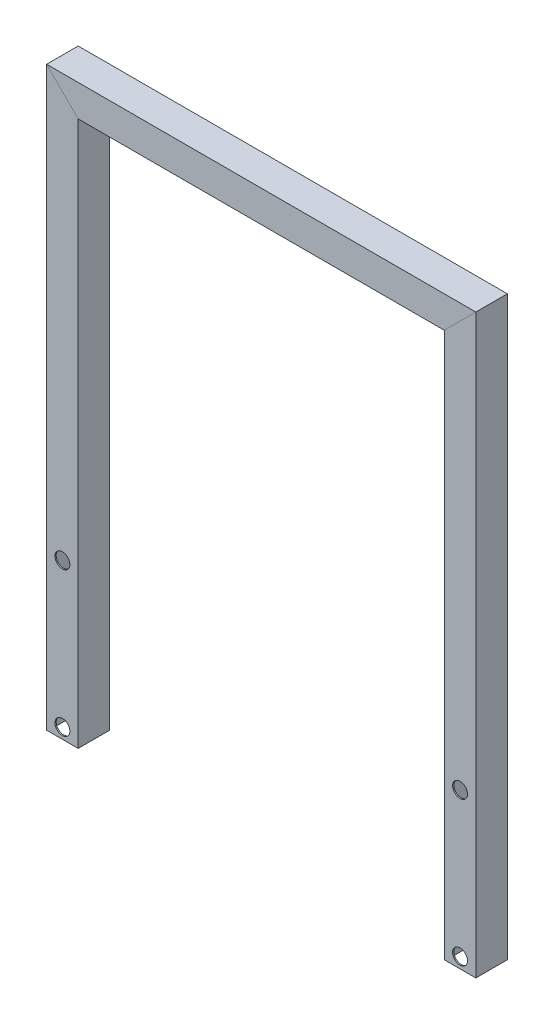
ISO-10303-21;
HEADER;
FILE_DESCRIPTION(('STEP AP214'),'2;1');
FILE_NAME('part.step','',(''),(''),'','','');
FILE_SCHEMA(('AUTOMOTIVE_DESIGN { 1 0 10303 214 1 1 1 1 }'));
ENDSEC;
DATA;
#1=APPLICATION_CONTEXT('core data for automotive mechanical design processes');
#2=APPLICATION_PROTOCOL_DEFINITION('international standard','automotive_design',2000,#1);
#3=PRODUCT_CONTEXT('',#1,'mechanical');
#4=PRODUCT('Part','Part','',(#3));
#5=PRODUCT_RELATED_PRODUCT_CATEGORY('part','',(#4));
#6=PRODUCT_DEFINITION_FORMATION('','',#4);
#7=PRODUCT_DEFINITION_CONTEXT('part definition',#1,'design');
#8=PRODUCT_DEFINITION('design','',#6,#7);
#9=PRODUCT_DEFINITION_SHAPE('','',#8);
#10=(LENGTH_UNIT() NAMED_UNIT(*) SI_UNIT(.MILLI.,.METRE.));
#11=(NAMED_UNIT(*) PLANE_ANGLE_UNIT() SI_UNIT($,.RADIAN.));
#12=(NAMED_UNIT(*) SI_UNIT($,.STERADIAN.) SOLID_ANGLE_UNIT());
#13=UNCERTAINTY_MEASURE_WITH_UNIT(LENGTH_MEASURE(1.E-05),#10,'distance_accuracy_value','');
#14=(GEOMETRIC_REPRESENTATION_CONTEXT(3) GLOBAL_UNCERTAINTY_ASSIGNED_CONTEXT((#13)) GLOBAL_UNIT_ASSIGNED_CONTEXT((#10,
#11,#12)) REPRESENTATION_CONTEXT('',''));
#15=CARTESIAN_POINT('',(0.,0.,0.));
#16=DIRECTION('',(0.,0.,1.));
#17=DIRECTION('',(1.,0.,0.));
#18=AXIS2_PLACEMENT_3D('',#15,#16,#17);
#19=CARTESIAN_POINT('',(-12.6999999999999,451.422308916705,12.7));
#20=DIRECTION('',(1.,0.,0.));
#21=DIRECTION('',(0.,0.,-1.));
#22=AXIS2_PLACEMENT_3D('',#19,#20,#21);
#23=PLANE('',#22);
#24=DIRECTION('',(0.,0.,1.));
#25=VECTOR('',#24,1.);
#26=CARTESIAN_POINT('',(-12.6999999999999,464.122308916705,12.7));
#27=LINE('',#26,#25);
#28=CARTESIAN_POINT('',(-12.6999999999999,464.122308916705,-12.7));
#29=VERTEX_POINT('',#28);
#30=CARTESIAN_POINT('',(-12.6999999999999,464.122308916705,12.7));
#31=VERTEX_POINT('',#30);
#32=EDGE_CURVE('E171',#29,#31,#27,.T.);
#33=ORIENTED_EDGE('',*,*,#32,.F.);
#34=DIRECTION('',(0.,-1.,0.));
#35=VECTOR('',#34,1.);
#36=CARTESIAN_POINT('',(-12.6999999999999,451.422308916705,-12.7));
#37=LINE('',#36,#35);
#38=CARTESIAN_POINT('',(-12.6999999999999,0.,-12.7));
#39=VERTEX_POINT('',#38);
#40=EDGE_CURVE('E167',#29,#39,#37,.T.);
#41=ORIENTED_EDGE('',*,*,#40,.T.);
#42=DIRECTION('',(0.,0.,1.));
#43=VECTOR('',#42,1.);
#44=CARTESIAN_POINT('',(-12.6999999999999,0.,12.7));
#45=LINE('',#44,#43);
#46=CARTESIAN_POINT('',(-12.6999999999999,0.,12.7));
#47=VERTEX_POINT('',#46);
#48=EDGE_CURVE('E194',#39,#47,#45,.T.);
#49=ORIENTED_EDGE('',*,*,#48,.T.);
#50=DIRECTION('',(0.,-1.,0.));
#51=VECTOR('',#50,1.);
#52=CARTESIAN_POINT('',(-12.6999999999999,451.422308916705,12.7));
#53=LINE('',#52,#51);
#54=EDGE_CURVE('E191',#31,#47,#53,.T.);
#55=ORIENTED_EDGE('',*,*,#54,.F.);
#56=EDGE_LOOP('',(#33,#41,#49,#55));
#57=FACE_BOUND('',#56,.T.);
#58=ADVANCED_FACE('F90',(#57),#23,.F.);
#59=CARTESIAN_POINT('',(12.7,451.422308916705,12.7));
#60=DIRECTION('',(0.,0.,-1.));
#61=DIRECTION('',(-1.,0.,0.));
#62=AXIS2_PLACEMENT_3D('',#59,#60,#61);
#63=PLANE('',#62);
#64=CARTESIAN_POINT('',(0.,8.58948173587412,12.7));
#65=DIRECTION('',(0.,0.,-1.));
#66=DIRECTION('',(-1.,0.,0.));
#67=AXIS2_PLACEMENT_3D('',#64,#65,#66);
#68=CIRCLE('',#67,6.00000000000004);
#69=CARTESIAN_POINT('',(-6.00000000000004,8.58948173587412,12.7));
#70=VERTEX_POINT('',#69);
#71=EDGE_CURVE('E198',#70,#70,#68,.F.);
#72=ORIENTED_EDGE('',*,*,#71,.F.);
#73=EDGE_LOOP('',(#72));
#74=FACE_BOUND('',#73,.T.);
#75=CARTESIAN_POINT('',(6.62248034188906E-11,124.72575791985,12.7));
#76=DIRECTION('',(0.,0.,-1.));
#77=DIRECTION('',(-1.,0.,0.));
#78=AXIS2_PLACEMENT_3D('',#75,#76,#77);
#79=CIRCLE('',#78,6.00000000003005);
#80=CARTESIAN_POINT('',(-5.99999999996382,124.72575791985,12.7));
#81=VERTEX_POINT('',#80);
#82=EDGE_CURVE('E231',#81,#81,#79,.F.);
#83=ORIENTED_EDGE('',*,*,#82,.F.);
#84=EDGE_LOOP('',(#83));
#85=FACE_BOUND('',#84,.T.);
#86=DIRECTION('',(0.707106781186547,-0.707106781186548,0.));
#87=VECTOR('',#86,1.);
#88=CARTESIAN_POINT('',(6.35000000000005,445.072308916705,12.7));
#89=LINE('',#88,#87);
#90=CARTESIAN_POINT('',(12.7,438.722308916705,12.7));
#91=VERTEX_POINT('',#90);
#92=EDGE_CURVE('E100',#31,#91,#89,.T.);
#93=ORIENTED_EDGE('',*,*,#92,.F.);
#94=ORIENTED_EDGE('',*,*,#54,.T.);
#95=DIRECTION('',(1.,0.,0.));
#96=VECTOR('',#95,1.);
#97=CARTESIAN_POINT('',(12.7,0.,12.7));
#98=LINE('',#97,#96);
#99=CARTESIAN_POINT('',(12.7,0.,12.7));
#100=VERTEX_POINT('',#99);
#101=EDGE_CURVE('E193',#47,#100,#98,.T.);
#102=ORIENTED_EDGE('',*,*,#101,.T.);
#103=DIRECTION('',(0.,-1.,0.));
#104=VECTOR('',#103,1.);
#105=CARTESIAN_POINT('',(12.7,451.422308916705,12.7));
#106=LINE('',#105,#104);
#107=EDGE_CURVE('E195',#91,#100,#106,.T.);
#108=ORIENTED_EDGE('',*,*,#107,.F.);
#109=EDGE_LOOP('',(#93,#94,#102,#108));
#110=FACE_BOUND('',#109,.T.);
#111=ADVANCED_FACE('F273',(#74,#85,#110),#63,.F.);
#112=CARTESIAN_POINT('',(12.7,451.422308916705,12.7));
#113=DIRECTION('',(-1.,0.,0.));
#114=DIRECTION('',(0.,0.,1.));
#115=AXIS2_PLACEMENT_3D('',#112,#113,#114);
#116=PLANE('',#115);
#117=DIRECTION('',(0.,0.,-1.));
#118=VECTOR('',#117,1.);
#119=CARTESIAN_POINT('',(12.7,438.722308916705,12.7));
#120=LINE('',#119,#118);
#121=CARTESIAN_POINT('',(12.7000000000001,438.722308916705,-12.7));
#122=VERTEX_POINT('',#121);
#123=EDGE_CURVE('E13',#91,#122,#120,.T.);
#124=ORIENTED_EDGE('',*,*,#123,.F.);
#125=ORIENTED_EDGE('',*,*,#107,.T.);
#126=DIRECTION('',(0.,0.,-1.));
#127=VECTOR('',#126,1.);
#128=CARTESIAN_POINT('',(12.7,0.,12.7));
#129=LINE('',#128,#127);
#130=CARTESIAN_POINT('',(12.7,0.,-12.7));
#131=VERTEX_POINT('',#130);
#132=EDGE_CURVE('E156',#100,#131,#129,.T.);
#133=ORIENTED_EDGE('',*,*,#132,.T.);
#134=DIRECTION('',(0.,-1.,0.));
#135=VECTOR('',#134,1.);
#136=CARTESIAN_POINT('',(12.7,451.422308916705,-12.7));
#137=LINE('',#136,#135);
#138=EDGE_CURVE('E151',#122,#131,#137,.T.);
#139=ORIENTED_EDGE('',*,*,#138,.F.);
#140=EDGE_LOOP('',(#124,#125,#133,#139));
#141=FACE_BOUND('',#140,.T.);
#142=ADVANCED_FACE('F153',(#141),#116,.F.);
#143=CARTESIAN_POINT('',(11.7,451.422308916705,11.7));
#144=DIRECTION('',(-1.,0.,0.));
#145=DIRECTION('',(0.,0.,1.));
#146=AXIS2_PLACEMENT_3D('',#143,#144,#145);
#147=PLANE('',#146);
#148=DIRECTION('',(0.,-1.,0.));
#149=VECTOR('',#148,1.);
#150=CARTESIAN_POINT('',(11.7,451.422308916705,11.7));
#151=LINE('',#150,#149);
#152=CARTESIAN_POINT('',(11.7,439.722308916705,11.7));
#153=VERTEX_POINT('',#152);
#154=CARTESIAN_POINT('',(11.7,0.,11.7));
#155=VERTEX_POINT('',#154);
#156=EDGE_CURVE('E186',#153,#155,#151,.T.);
#157=ORIENTED_EDGE('',*,*,#156,.F.);
#158=DIRECTION('',(0.,0.,-1.));
#159=VECTOR('',#158,1.);
#160=CARTESIAN_POINT('',(11.7,439.722308916705,11.7));
#161=LINE('',#160,#159);
#162=CARTESIAN_POINT('',(11.7,439.722308916705,-11.7));
#163=VERTEX_POINT('',#162);
#164=EDGE_CURVE('E181',#153,#163,#161,.T.);
#165=ORIENTED_EDGE('',*,*,#164,.T.);
#166=DIRECTION('',(0.,-1.,0.));
#167=VECTOR('',#166,1.);
#168=CARTESIAN_POINT('',(11.7,451.422308916705,-11.7));
#169=LINE('',#168,#167);
#170=CARTESIAN_POINT('',(11.7,0.,-11.7));
#171=VERTEX_POINT('',#170);
#172=EDGE_CURVE('E94',#163,#171,#169,.T.);
#173=ORIENTED_EDGE('',*,*,#172,.T.);
#174=DIRECTION('',(0.,0.,-1.));
#175=VECTOR('',#174,1.);
#176=CARTESIAN_POINT('',(11.7,0.,11.7));
#177=LINE('',#176,#175);
#178=EDGE_CURVE('E206',#155,#171,#177,.T.);
#179=ORIENTED_EDGE('',*,*,#178,.F.);
#180=EDGE_LOOP('',(#157,#165,#173,#179));
#181=FACE_BOUND('',#180,.T.);
#182=ADVANCED_FACE('F282',(#181),#147,.T.);
#183=CARTESIAN_POINT('',(11.7,451.422308916705,11.7));
#184=DIRECTION('',(0.,0.,-1.));
#185=DIRECTION('',(-1.,0.,0.));
#186=AXIS2_PLACEMENT_3D('',#183,#184,#185);
#187=PLANE('',#186);
#188=CARTESIAN_POINT('',(0.,8.58948173587412,11.7));
#189=DIRECTION('',(0.,0.,-1.));
#190=DIRECTION('',(-1.,0.,0.));
#191=AXIS2_PLACEMENT_3D('',#188,#189,#190);
#192=CIRCLE('',#191,6.00000000000004);
#193=CARTESIAN_POINT('',(-6.00000000000004,8.58948173587412,11.7));
#194=VERTEX_POINT('',#193);
#195=EDGE_CURVE('E225',#194,#194,#192,.F.);
#196=ORIENTED_EDGE('',*,*,#195,.T.);
#197=EDGE_LOOP('',(#196));
#198=FACE_BOUND('',#197,.T.);
#199=CARTESIAN_POINT('',(6.62248034188906E-11,124.72575791985,11.7));
#200=DIRECTION('',(0.,0.,-1.));
#201=DIRECTION('',(-1.,0.,0.));
#202=AXIS2_PLACEMENT_3D('',#199,#200,#201);
#203=CIRCLE('',#202,6.00000000003005);
#204=CARTESIAN_POINT('',(-5.99999999996382,124.72575791985,11.7));
#205=VERTEX_POINT('',#204);
#206=EDGE_CURVE('E234',#205,#205,#203,.F.);
#207=ORIENTED_EDGE('',*,*,#206,.T.);
#208=EDGE_LOOP('',(#207));
#209=FACE_BOUND('',#208,.T.);
#210=DIRECTION('',(0.,-1.,0.));
#211=VECTOR('',#210,1.);
#212=CARTESIAN_POINT('',(-11.6999999999999,451.422308916705,11.7));
#213=LINE('',#212,#211);
#214=CARTESIAN_POINT('',(-11.6999999999999,463.122308916705,11.7));
#215=VERTEX_POINT('',#214);
#216=CARTESIAN_POINT('',(-11.6999999999999,0.,11.7));
#217=VERTEX_POINT('',#216);
#218=EDGE_CURVE('E189',#215,#217,#213,.T.);
#219=ORIENTED_EDGE('',*,*,#218,.F.);
#220=DIRECTION('',(0.707106781186547,-0.707106781186548,0.));
#221=VECTOR('',#220,1.);
#222=CARTESIAN_POINT('',(5.85000000000005,445.572308916705,11.7));
#223=LINE('',#222,#221);
#224=EDGE_CURVE('E183',#215,#153,#223,.T.);
#225=ORIENTED_EDGE('',*,*,#224,.T.);
#226=ORIENTED_EDGE('',*,*,#156,.T.);
#227=DIRECTION('',(1.,0.,0.));
#228=VECTOR('',#227,1.);
#229=CARTESIAN_POINT('',(11.7,0.,11.7));
#230=LINE('',#229,#228);
#231=EDGE_CURVE('E172',#217,#155,#230,.T.);
#232=ORIENTED_EDGE('',*,*,#231,.F.);
#233=EDGE_LOOP('',(#219,#225,#226,#232));
#234=FACE_BOUND('',#233,.T.);
#235=ADVANCED_FACE('F286',(#198,#209,#234),#187,.T.);
#236=CARTESIAN_POINT('',(-11.6999999999999,451.422308916705,11.7));
#237=DIRECTION('',(1.,0.,0.));
#238=DIRECTION('',(0.,0.,-1.));
#239=AXIS2_PLACEMENT_3D('',#236,#237,#238);
#240=PLANE('',#239);
#241=DIRECTION('',(0.,-1.,0.));
#242=VECTOR('',#241,1.);
#243=CARTESIAN_POINT('',(-11.6999999999999,451.422308916705,-11.7));
#244=LINE('',#243,#242);
#245=CARTESIAN_POINT('',(-11.6999999999999,463.122308916705,-11.7));
#246=VERTEX_POINT('',#245);
#247=CARTESIAN_POINT('',(-11.6999999999999,0.,-11.7));
#248=VERTEX_POINT('',#247);
#249=EDGE_CURVE('E161',#246,#248,#244,.T.);
#250=ORIENTED_EDGE('',*,*,#249,.F.);
#251=DIRECTION('',(0.,0.,1.));
#252=VECTOR('',#251,1.);
#253=CARTESIAN_POINT('',(-11.6999999999999,463.122308916705,11.7));
#254=LINE('',#253,#252);
#255=EDGE_CURVE('E187',#246,#215,#254,.T.);
#256=ORIENTED_EDGE('',*,*,#255,.T.);
#257=ORIENTED_EDGE('',*,*,#218,.T.);
#258=DIRECTION('',(0.,0.,1.));
#259=VECTOR('',#258,1.);
#260=CARTESIAN_POINT('',(-11.6999999999999,0.,11.7));
#261=LINE('',#260,#259);
#262=EDGE_CURVE('E212',#248,#217,#261,.T.);
#263=ORIENTED_EDGE('',*,*,#262,.F.);
#264=EDGE_LOOP('',(#250,#256,#257,#263));
#265=FACE_BOUND('',#264,.T.);
#266=ADVANCED_FACE('F290',(#265),#240,.T.);
#267=CARTESIAN_POINT('',(11.7,451.422308916705,-11.7));
#268=DIRECTION('',(0.,0.,1.));
#269=DIRECTION('',(1.,0.,0.));
#270=AXIS2_PLACEMENT_3D('',#267,#268,#269);
#271=PLANE('',#270);
#272=CARTESIAN_POINT('',(0.,8.58948173587409,-11.7));
#273=DIRECTION('',(0.,0.,1.));
#274=DIRECTION('',(1.,0.,0.));
#275=AXIS2_PLACEMENT_3D('',#272,#273,#274);
#276=CIRCLE('',#275,6.00000000000004);
#277=CARTESIAN_POINT('',(6.00000000000004,8.58948173587409,-11.7));
#278=VERTEX_POINT('',#277);
#279=EDGE_CURVE('E228',#278,#278,#276,.F.);
#280=ORIENTED_EDGE('',*,*,#279,.T.);
#281=EDGE_LOOP('',(#280));
#282=FACE_BOUND('',#281,.T.);
#283=CARTESIAN_POINT('',(6.62248034188906E-11,124.72575791985,-11.7));
#284=DIRECTION('',(0.,0.,1.));
#285=DIRECTION('',(1.,0.,0.));
#286=AXIS2_PLACEMENT_3D('',#283,#284,#285);
#287=CIRCLE('',#286,6.00000000003005);
#288=CARTESIAN_POINT('',(6.00000000009627,124.72575791985,-11.7));
#289=VERTEX_POINT('',#288);
#290=EDGE_CURVE('E237',#289,#289,#287,.F.);
#291=ORIENTED_EDGE('',*,*,#290,.T.);
#292=EDGE_LOOP('',(#291));
#293=FACE_BOUND('',#292,.T.);
#294=ORIENTED_EDGE('',*,*,#172,.F.);
#295=DIRECTION('',(-0.707106781186547,0.707106781186548,0.));
#296=VECTOR('',#295,1.);
#297=CARTESIAN_POINT('',(5.85000000000004,445.572308916705,-11.7));
#298=LINE('',#297,#296);
#299=EDGE_CURVE('E108',#163,#246,#298,.T.);
#300=ORIENTED_EDGE('',*,*,#299,.T.);
#301=ORIENTED_EDGE('',*,*,#249,.T.);
#302=DIRECTION('',(-1.,0.,0.));
#303=VECTOR('',#302,1.);
#304=CARTESIAN_POINT('',(11.7,0.,-11.7));
#305=LINE('',#304,#303);
#306=EDGE_CURVE('E209',#171,#248,#305,.T.);
#307=ORIENTED_EDGE('',*,*,#306,.F.);
#308=EDGE_LOOP('',(#294,#300,#301,#307));
#309=FACE_BOUND('',#308,.T.);
#310=ADVANCED_FACE('F252',(#282,#293,#309),#271,.T.);
#311=CARTESIAN_POINT('',(12.7,451.422308916705,-12.7));
#312=DIRECTION('',(0.,0.,1.));
#313=DIRECTION('',(1.,0.,0.));
#314=AXIS2_PLACEMENT_3D('',#311,#312,#313);
#315=PLANE('',#314);
#316=CARTESIAN_POINT('',(0.,8.58948173587409,-12.7000000000001));
#317=DIRECTION('',(0.,0.,1.));
#318=DIRECTION('',(1.,0.,0.));
#319=AXIS2_PLACEMENT_3D('',#316,#317,#318);
#320=CIRCLE('',#319,6.00000000000004);
#321=CARTESIAN_POINT('',(6.00000000000004,8.58948173587409,-12.7000000000001));
#322=VERTEX_POINT('',#321);
#323=EDGE_CURVE('E240',#322,#322,#320,.F.);
#324=ORIENTED_EDGE('',*,*,#323,.F.);
#325=EDGE_LOOP('',(#324));
#326=FACE_BOUND('',#325,.T.);
#327=CARTESIAN_POINT('',(6.62248034188906E-11,124.72575791985,-12.7000000000001));
#328=DIRECTION('',(0.,0.,1.));
#329=DIRECTION('',(1.,0.,0.));
#330=AXIS2_PLACEMENT_3D('',#327,#328,#329);
#331=CIRCLE('',#330,6.00000000003005);
#332=CARTESIAN_POINT('',(6.00000000009627,124.72575791985,-12.7000000000001));
#333=VERTEX_POINT('',#332);
#334=EDGE_CURVE('E241',#333,#333,#331,.F.);
#335=ORIENTED_EDGE('',*,*,#334,.F.);
#336=EDGE_LOOP('',(#335));
#337=FACE_BOUND('',#336,.T.);
#338=DIRECTION('',(-0.707106781186547,0.707106781186548,0.));
#339=VECTOR('',#338,1.);
#340=CARTESIAN_POINT('',(6.35000000000005,445.072308916705,-12.7));
#341=LINE('',#340,#339);
#342=EDGE_CURVE('E165',#122,#29,#341,.T.);
#343=ORIENTED_EDGE('',*,*,#342,.F.);
#344=ORIENTED_EDGE('',*,*,#138,.T.);
#345=DIRECTION('',(-1.,0.,0.));
#346=VECTOR('',#345,1.);
#347=CARTESIAN_POINT('',(12.7,0.,-12.7));
#348=LINE('',#347,#346);
#349=EDGE_CURVE('E160',#131,#39,#348,.T.);
#350=ORIENTED_EDGE('',*,*,#349,.T.);
#351=ORIENTED_EDGE('',*,*,#40,.F.);
#352=EDGE_LOOP('',(#343,#344,#350,#351));
#353=FACE_BOUND('',#352,.T.);
#354=ADVANCED_FACE('F166',(#326,#337,#353),#315,.F.);
#355=CARTESIAN_POINT('',(320.,-1.11022302462516E-13,0.));
#356=DIRECTION('',(0.,1.,0.));
#357=DIRECTION('',(0.,0.,-1.));
#358=AXIS2_PLACEMENT_3D('',#355,#356,#357);
#359=PLANE('',#358);
#360=ORIENTED_EDGE('',*,*,#178,.T.);
#361=ORIENTED_EDGE('',*,*,#306,.T.);
#362=ORIENTED_EDGE('',*,*,#262,.T.);
#363=ORIENTED_EDGE('',*,*,#231,.T.);
#364=EDGE_LOOP('',(#360,#361,#362,#363));
#365=FACE_BOUND('',#364,.T.);
#366=ORIENTED_EDGE('',*,*,#48,.F.);
#367=ORIENTED_EDGE('',*,*,#349,.F.);
#368=ORIENTED_EDGE('',*,*,#132,.F.);
#369=ORIENTED_EDGE('',*,*,#101,.F.);
#370=EDGE_LOOP('',(#366,#367,#368,#369));
#371=FACE_BOUND('',#370,.T.);
#372=ADVANCED_FACE('F251',(#365,#371),#359,.F.);
#373=CARTESIAN_POINT('',(0.,451.422308916705,0.));
#374=DIRECTION('',(0.707106781186548,0.707106781186547,0.));
#375=DIRECTION('',(-0.707106781186547,0.707106781186548,0.));
#376=AXIS2_PLACEMENT_3D('',#373,#374,#375);
#377=PLANE('',#376);
#378=ORIENTED_EDGE('',*,*,#164,.F.);
#379=ORIENTED_EDGE('',*,*,#224,.F.);
#380=ORIENTED_EDGE('',*,*,#255,.F.);
#381=ORIENTED_EDGE('',*,*,#299,.F.);
#382=EDGE_LOOP('',(#378,#379,#380,#381));
#383=FACE_BOUND('',#382,.T.);
#384=ORIENTED_EDGE('',*,*,#342,.T.);
#385=ORIENTED_EDGE('',*,*,#32,.T.);
#386=ORIENTED_EDGE('',*,*,#92,.T.);
#387=ORIENTED_EDGE('',*,*,#123,.T.);
#388=EDGE_LOOP('',(#384,#385,#386,#387));
#389=FACE_BOUND('',#388,.T.);
#390=ADVANCED_FACE('F92',(#383,#389),#377,.T.);
#391=CARTESIAN_POINT('',(6.62248034188906E-11,124.72575791985,-12.7000000000001));
#392=DIRECTION('',(0.,0.,1.));
#393=DIRECTION('',(1.,0.,0.));
#394=AXIS2_PLACEMENT_3D('',#391,#392,#393);
#395=CYLINDRICAL_SURFACE('',#394,6.00000000003005);
#396=ORIENTED_EDGE('',*,*,#290,.F.);
#397=EDGE_LOOP('',(#396));
#398=FACE_BOUND('',#397,.T.);
#399=ORIENTED_EDGE('',*,*,#334,.T.);
#400=EDGE_LOOP('',(#399));
#401=FACE_BOUND('',#400,.T.);
#402=ADVANCED_FACE('F256',(#398,#401),#395,.F.);
#403=CARTESIAN_POINT('',(0.,8.58948173587409,-12.7000000000001));
#404=DIRECTION('',(0.,0.,1.));
#405=DIRECTION('',(1.,0.,0.));
#406=AXIS2_PLACEMENT_3D('',#403,#404,#405);
#407=CYLINDRICAL_SURFACE('',#406,6.00000000000004);
#408=ORIENTED_EDGE('',*,*,#279,.F.);
#409=EDGE_LOOP('',(#408));
#410=FACE_BOUND('',#409,.T.);
#411=ORIENTED_EDGE('',*,*,#323,.T.);
#412=EDGE_LOOP('',(#411));
#413=FACE_BOUND('',#412,.T.);
#414=ADVANCED_FACE('F247',(#410,#413),#407,.F.);
#415=ORIENTED_EDGE('',*,*,#206,.F.);
#416=EDGE_LOOP('',(#415));
#417=FACE_BOUND('',#416,.T.);
#418=ORIENTED_EDGE('',*,*,#82,.T.);
#419=EDGE_LOOP('',(#418));
#420=FACE_BOUND('',#419,.T.);
#421=ADVANCED_FACE('F260',(#417,#420),#395,.F.);
#422=ORIENTED_EDGE('',*,*,#195,.F.);
#423=EDGE_LOOP('',(#422));
#424=FACE_BOUND('',#423,.T.);
#425=ORIENTED_EDGE('',*,*,#71,.T.);
#426=EDGE_LOOP('',(#425));
#427=FACE_BOUND('',#426,.T.);
#428=ADVANCED_FACE('F267',(#424,#427),#407,.F.);
#429=CLOSED_SHELL('',(#58,#111,#142,#182,#235,#266,#310,#354,#372,#390,#402,#414,#421,#428));
#430=MANIFOLD_SOLID_BREP('B2',#429);
#431=CARTESIAN_POINT('',(320.,464.122308916705,12.6999999999999));
#432=DIRECTION('',(0.,-1.,0.));
#433=DIRECTION('',(0.,0.,-1.));
#434=AXIS2_PLACEMENT_3D('',#431,#432,#433);
#435=PLANE('',#434);
#436=DIRECTION('',(0.,0.,-1.));
#437=VECTOR('',#436,1.);
#438=CARTESIAN_POINT('',(-12.6999999999999,464.122308916705,12.7000000000001));
#439=LINE('',#438,#437);
#440=CARTESIAN_POINT('',(-12.6999999999999,464.122308916705,12.7));
#441=VERTEX_POINT('',#440);
#442=CARTESIAN_POINT('',(-12.6999999999999,464.122308916705,-12.7));
#443=VERTEX_POINT('',#442);
#444=EDGE_CURVE('E580',#441,#443,#439,.T.);
#445=ORIENTED_EDGE('',*,*,#444,.F.);
#446=DIRECTION('',(-1.,0.,0.));
#447=VECTOR('',#446,1.);
#448=CARTESIAN_POINT('',(320.,464.122308916705,12.6999999999999));
#449=LINE('',#448,#447);
#450=CARTESIAN_POINT('',(332.7,464.122308916705,12.6999999999999));
#451=VERTEX_POINT('',#450);
#452=EDGE_CURVE('E609',#451,#441,#449,.T.);
#453=ORIENTED_EDGE('',*,*,#452,.F.);
#454=DIRECTION('',(0.,0.,1.));
#455=VECTOR('',#454,1.);
#456=CARTESIAN_POINT('',(332.7,464.122308916705,12.6999999999999));
#457=LINE('',#456,#455);
#458=CARTESIAN_POINT('',(332.7,464.122308916705,-12.7000000000001));
#459=VERTEX_POINT('',#458);
#460=EDGE_CURVE('E572',#459,#451,#457,.T.);
#461=ORIENTED_EDGE('',*,*,#460,.F.);
#462=DIRECTION('',(-1.,0.,0.));
#463=VECTOR('',#462,1.);
#464=CARTESIAN_POINT('',(320.,464.122308916705,-12.7000000000001));
#465=LINE('',#464,#463);
#466=EDGE_CURVE('E491',#459,#443,#465,.T.);
#467=ORIENTED_EDGE('',*,*,#466,.T.);
#468=EDGE_LOOP('',(#445,#453,#461,#467));
#469=FACE_BOUND('',#468,.T.);
#470=ADVANCED_FACE('F487',(#469),#435,.F.);
#471=CARTESIAN_POINT('',(320.,438.722308916705,12.6999999999999));
#472=DIRECTION('',(0.,0.,-1.));
#473=DIRECTION('',(-1.,0.,0.));
#474=AXIS2_PLACEMENT_3D('',#471,#472,#473);
#475=PLANE('',#474);
#476=DIRECTION('',(-0.707106781186547,0.707106781186548,0.));
#477=VECTOR('',#476,1.);
#478=CARTESIAN_POINT('',(166.35,285.072308916705,12.6999999999999));
#479=LINE('',#478,#477);
#480=CARTESIAN_POINT('',(12.7000000000001,438.722308916705,12.7));
#481=VERTEX_POINT('',#480);
#482=EDGE_CURVE('E577',#481,#441,#479,.T.);
#483=ORIENTED_EDGE('',*,*,#482,.F.);
#484=DIRECTION('',(-1.,0.,0.));
#485=VECTOR('',#484,1.);
#486=CARTESIAN_POINT('',(320.,438.722308916705,12.6999999999999));
#487=LINE('',#486,#485);
#488=CARTESIAN_POINT('',(307.3,438.722308916705,12.6999999999999));
#489=VERTEX_POINT('',#488);
#490=EDGE_CURVE('E608',#489,#481,#487,.T.);
#491=ORIENTED_EDGE('',*,*,#490,.F.);
#492=DIRECTION('',(-0.707106781186547,-0.707106781186548,0.));
#493=VECTOR('',#492,1.);
#494=CARTESIAN_POINT('',(313.65,445.072308916705,12.6999999999999));
#495=LINE('',#494,#493);
#496=EDGE_CURVE('E576',#451,#489,#495,.T.);
#497=ORIENTED_EDGE('',*,*,#496,.F.);
#498=ORIENTED_EDGE('',*,*,#452,.T.);
#499=EDGE_LOOP('',(#483,#491,#497,#498));
#500=FACE_BOUND('',#499,.T.);
#501=ADVANCED_FACE('F615',(#500),#475,.F.);
#502=CARTESIAN_POINT('',(320.,438.722308916705,12.6999999999999));
#503=DIRECTION('',(0.,1.,0.));
#504=DIRECTION('',(0.,0.,1.));
#505=AXIS2_PLACEMENT_3D('',#502,#503,#504);
#506=PLANE('',#505);
#507=DIRECTION('',(0.,0.,1.));
#508=VECTOR('',#507,1.);
#509=CARTESIAN_POINT('',(12.7000000000001,438.722308916705,12.7000000000001));
#510=LINE('',#509,#508);
#511=CARTESIAN_POINT('',(12.7000000000001,438.722308916705,-12.7));
#512=VERTEX_POINT('',#511);
#513=EDGE_CURVE('E88',#512,#481,#510,.T.);
#514=ORIENTED_EDGE('',*,*,#513,.F.);
#515=DIRECTION('',(-1.,0.,0.));
#516=VECTOR('',#515,1.);
#517=CARTESIAN_POINT('',(320.,438.722308916705,-12.7000000000001));
#518=LINE('',#517,#516);
#519=CARTESIAN_POINT('',(307.3,438.722308916705,-12.7000000000001));
#520=VERTEX_POINT('',#519);
#521=EDGE_CURVE('E554',#520,#512,#518,.T.);
#522=ORIENTED_EDGE('',*,*,#521,.F.);
#523=DIRECTION('',(0.,0.,-1.));
#524=VECTOR('',#523,1.);
#525=CARTESIAN_POINT('',(307.3,438.722308916705,12.6999999999999));
#526=LINE('',#525,#524);
#527=EDGE_CURVE('E559',#489,#520,#526,.T.);
#528=ORIENTED_EDGE('',*,*,#527,.F.);
#529=ORIENTED_EDGE('',*,*,#490,.T.);
#530=EDGE_LOOP('',(#514,#522,#528,#529));
#531=FACE_BOUND('',#530,.T.);
#532=ADVANCED_FACE('F556',(#531),#506,.F.);
#533=CARTESIAN_POINT('',(320.,439.722308916705,11.6999999999999));
#534=DIRECTION('',(0.,1.,0.));
#535=DIRECTION('',(0.,0.,1.));
#536=AXIS2_PLACEMENT_3D('',#533,#534,#535);
#537=PLANE('',#536);
#538=DIRECTION('',(-1.,0.,0.));
#539=VECTOR('',#538,1.);
#540=CARTESIAN_POINT('',(320.,439.722308916705,-11.7000000000001));
#541=LINE('',#540,#539);
#542=CARTESIAN_POINT('',(308.3,439.722308916705,-11.7000000000001));
#543=VERTEX_POINT('',#542);
#544=CARTESIAN_POINT('',(11.7000000000001,439.722308916705,-11.7));
#545=VERTEX_POINT('',#544);
#546=EDGE_CURVE('E593',#543,#545,#541,.T.);
#547=ORIENTED_EDGE('',*,*,#546,.T.);
#548=DIRECTION('',(0.,0.,1.));
#549=VECTOR('',#548,1.);
#550=CARTESIAN_POINT('',(11.7000000000001,439.722308916705,11.7000000000001));
#551=LINE('',#550,#549);
#552=CARTESIAN_POINT('',(11.7000000000001,439.722308916705,11.7));
#553=VERTEX_POINT('',#552);
#554=EDGE_CURVE('E521',#545,#553,#551,.T.);
#555=ORIENTED_EDGE('',*,*,#554,.T.);
#556=DIRECTION('',(-1.,0.,0.));
#557=VECTOR('',#556,1.);
#558=CARTESIAN_POINT('',(320.,439.722308916705,11.6999999999999));
#559=LINE('',#558,#557);
#560=CARTESIAN_POINT('',(308.3,439.722308916705,11.6999999999999));
#561=VERTEX_POINT('',#560);
#562=EDGE_CURVE('E596',#561,#553,#559,.T.);
#563=ORIENTED_EDGE('',*,*,#562,.F.);
#564=DIRECTION('',(0.,0.,-1.));
#565=VECTOR('',#564,1.);
#566=CARTESIAN_POINT('',(308.3,439.722308916705,11.6999999999999));
#567=LINE('',#566,#565);
#568=EDGE_CURVE('E592',#561,#543,#567,.T.);
#569=ORIENTED_EDGE('',*,*,#568,.T.);
#570=EDGE_LOOP('',(#547,#555,#563,#569));
#571=FACE_BOUND('',#570,.T.);
#572=ADVANCED_FACE('F632',(#571),#537,.T.);
#573=CARTESIAN_POINT('',(320.,439.722308916705,11.6999999999999));
#574=DIRECTION('',(0.,0.,-1.));
#575=DIRECTION('',(-1.,0.,0.));
#576=AXIS2_PLACEMENT_3D('',#573,#574,#575);
#577=PLANE('',#576);
#578=ORIENTED_EDGE('',*,*,#562,.T.);
#579=DIRECTION('',(-0.707106781186547,0.707106781186548,0.));
#580=VECTOR('',#579,1.);
#581=CARTESIAN_POINT('',(165.85,285.572308916705,11.6999999999999));
#582=LINE('',#581,#580);
#583=CARTESIAN_POINT('',(-11.6999999999999,463.122308916705,11.7000000000002));
#584=VERTEX_POINT('',#583);
#585=EDGE_CURVE('E506',#553,#584,#582,.T.);
#586=ORIENTED_EDGE('',*,*,#585,.T.);
#587=DIRECTION('',(-1.,0.,0.));
#588=VECTOR('',#587,1.);
#589=CARTESIAN_POINT('',(320.,463.122308916705,11.6999999999999));
#590=LINE('',#589,#588);
#591=CARTESIAN_POINT('',(331.7,463.122308916705,11.7));
#592=VERTEX_POINT('',#591);
#593=EDGE_CURVE('E600',#592,#584,#590,.T.);
#594=ORIENTED_EDGE('',*,*,#593,.F.);
#595=DIRECTION('',(-0.707106781186547,-0.707106781186548,0.));
#596=VECTOR('',#595,1.);
#597=CARTESIAN_POINT('',(314.15,445.572308916705,11.6999999999999));
#598=LINE('',#597,#596);
#599=EDGE_CURVE('E595',#592,#561,#598,.T.);
#600=ORIENTED_EDGE('',*,*,#599,.T.);
#601=EDGE_LOOP('',(#578,#586,#594,#600));
#602=FACE_BOUND('',#601,.T.);
#603=ADVANCED_FACE('F630',(#602),#577,.T.);
#604=CARTESIAN_POINT('',(320.,463.122308916705,11.6999999999999));
#605=DIRECTION('',(0.,-1.,0.));
#606=DIRECTION('',(0.,0.,-1.));
#607=AXIS2_PLACEMENT_3D('',#604,#605,#606);
#608=PLANE('',#607);
#609=ORIENTED_EDGE('',*,*,#593,.T.);
#610=DIRECTION('',(0.,0.,-1.));
#611=VECTOR('',#610,1.);
#612=CARTESIAN_POINT('',(-11.6999999999999,463.122308916705,11.7000000000001));
#613=LINE('',#612,#611);
#614=CARTESIAN_POINT('',(-11.6999999999998,463.122308916705,-11.7));
#615=VERTEX_POINT('',#614);
#616=EDGE_CURVE('E597',#584,#615,#613,.T.);
#617=ORIENTED_EDGE('',*,*,#616,.T.);
#618=DIRECTION('',(-1.,0.,0.));
#619=VECTOR('',#618,1.);
#620=CARTESIAN_POINT('',(320.,463.122308916705,-11.7000000000001));
#621=LINE('',#620,#619);
#622=CARTESIAN_POINT('',(331.7,463.122308916705,-11.7000000000001));
#623=VERTEX_POINT('',#622);
#624=EDGE_CURVE('E588',#623,#615,#621,.T.);
#625=ORIENTED_EDGE('',*,*,#624,.F.);
#626=DIRECTION('',(0.,0.,1.));
#627=VECTOR('',#626,1.);
#628=CARTESIAN_POINT('',(331.7,463.122308916705,11.6999999999999));
#629=LINE('',#628,#627);
#630=EDGE_CURVE('E599',#623,#592,#629,.T.);
#631=ORIENTED_EDGE('',*,*,#630,.T.);
#632=EDGE_LOOP('',(#609,#617,#625,#631));
#633=FACE_BOUND('',#632,.T.);
#634=ADVANCED_FACE('F625',(#633),#608,.T.);
#635=CARTESIAN_POINT('',(320.,439.722308916705,-11.7000000000001));
#636=DIRECTION('',(0.,0.,1.));
#637=DIRECTION('',(1.,0.,0.));
#638=AXIS2_PLACEMENT_3D('',#635,#636,#637);
#639=PLANE('',#638);
#640=ORIENTED_EDGE('',*,*,#624,.T.);
#641=DIRECTION('',(0.707106781186547,-0.707106781186548,0.));
#642=VECTOR('',#641,1.);
#643=CARTESIAN_POINT('',(165.85,285.572308916705,-11.7000000000001));
#644=LINE('',#643,#642);
#645=EDGE_CURVE('E516',#615,#545,#644,.T.);
#646=ORIENTED_EDGE('',*,*,#645,.T.);
#647=ORIENTED_EDGE('',*,*,#546,.F.);
#648=DIRECTION('',(0.707106781186547,0.707106781186548,0.));
#649=VECTOR('',#648,1.);
#650=CARTESIAN_POINT('',(314.15,445.572308916705,-11.7000000000001));
#651=LINE('',#650,#649);
#652=EDGE_CURVE('E565',#543,#623,#651,.T.);
#653=ORIENTED_EDGE('',*,*,#652,.T.);
#654=EDGE_LOOP('',(#640,#646,#647,#653));
#655=FACE_BOUND('',#654,.T.);
#656=ADVANCED_FACE('F635',(#655),#639,.T.);
#657=CARTESIAN_POINT('',(320.,438.722308916705,-12.7000000000001));
#658=DIRECTION('',(0.,0.,1.));
#659=DIRECTION('',(1.,0.,0.));
#660=AXIS2_PLACEMENT_3D('',#657,#658,#659);
#661=PLANE('',#660);
#662=DIRECTION('',(0.707106781186547,-0.707106781186548,0.));
#663=VECTOR('',#662,1.);
#664=CARTESIAN_POINT('',(166.35,285.072308916705,-12.7000000000001));
#665=LINE('',#664,#663);
#666=EDGE_CURVE('E497',#443,#512,#665,.T.);
#667=ORIENTED_EDGE('',*,*,#666,.F.);
#668=ORIENTED_EDGE('',*,*,#466,.F.);
#669=DIRECTION('',(0.707106781186547,0.707106781186548,0.));
#670=VECTOR('',#669,1.);
#671=CARTESIAN_POINT('',(313.65,445.072308916705,-12.7000000000001));
#672=LINE('',#671,#670);
#673=EDGE_CURVE('E564',#520,#459,#672,.T.);
#674=ORIENTED_EDGE('',*,*,#673,.F.);
#675=ORIENTED_EDGE('',*,*,#521,.T.);
#676=EDGE_LOOP('',(#667,#668,#674,#675));
#677=FACE_BOUND('',#676,.T.);
#678=ADVANCED_FACE('F568',(#677),#661,.F.);
#679=CARTESIAN_POINT('',(320.,451.422308916705,0.));
#680=DIRECTION('',(0.707106781186548,-0.707106781186547,0.));
#681=DIRECTION('',(0.707106781186547,0.707106781186548,0.));
#682=AXIS2_PLACEMENT_3D('',#679,#680,#681);
#683=PLANE('',#682);
#684=ORIENTED_EDGE('',*,*,#568,.F.);
#685=ORIENTED_EDGE('',*,*,#599,.F.);
#686=ORIENTED_EDGE('',*,*,#630,.F.);
#687=ORIENTED_EDGE('',*,*,#652,.F.);
#688=EDGE_LOOP('',(#684,#685,#686,#687));
#689=FACE_BOUND('',#688,.T.);
#690=ORIENTED_EDGE('',*,*,#673,.T.);
#691=ORIENTED_EDGE('',*,*,#460,.T.);
#692=ORIENTED_EDGE('',*,*,#496,.T.);
#693=ORIENTED_EDGE('',*,*,#527,.T.);
#694=EDGE_LOOP('',(#690,#691,#692,#693));
#695=FACE_BOUND('',#694,.T.);
#696=ADVANCED_FACE('F575',(#689,#695),#683,.T.);
#697=CARTESIAN_POINT('',(0.,451.422308916705,0.));
#698=DIRECTION('',(-0.707106781186548,-0.707106781186547,0.));
#699=DIRECTION('',(0.707106781186547,-0.707106781186548,0.));
#700=AXIS2_PLACEMENT_3D('',#697,#698,#699);
#701=PLANE('',#700);
#702=ORIENTED_EDGE('',*,*,#554,.F.);
#703=ORIENTED_EDGE('',*,*,#645,.F.);
#704=ORIENTED_EDGE('',*,*,#616,.F.);
#705=ORIENTED_EDGE('',*,*,#585,.F.);
#706=EDGE_LOOP('',(#702,#703,#704,#705));
#707=FACE_BOUND('',#706,.T.);
#708=ORIENTED_EDGE('',*,*,#482,.T.);
#709=ORIENTED_EDGE('',*,*,#444,.T.);
#710=ORIENTED_EDGE('',*,*,#666,.T.);
#711=ORIENTED_EDGE('',*,*,#513,.T.);
#712=EDGE_LOOP('',(#708,#709,#710,#711));
#713=FACE_BOUND('',#712,.T.);
#714=ADVANCED_FACE('F489',(#707,#713),#701,.T.);
#715=CLOSED_SHELL('',(#470,#501,#532,#572,#603,#634,#656,#678,#696,#714));
#716=MANIFOLD_SOLID_BREP('B7',#715);
#717=CARTESIAN_POINT('',(332.7,0.,12.7));
#718=DIRECTION('',(-1.,0.,0.));
#719=DIRECTION('',(0.,0.,1.));
#720=AXIS2_PLACEMENT_3D('',#717,#718,#719);
#721=PLANE('',#720);
#722=DIRECTION('',(0.,0.,-1.));
#723=VECTOR('',#722,1.);
#724=CARTESIAN_POINT('',(332.7,464.122308916705,12.7000000000001));
#725=LINE('',#724,#723);
#726=CARTESIAN_POINT('',(332.7,464.122308916705,12.6999999999999));
#727=VERTEX_POINT('',#726);
#728=CARTESIAN_POINT('',(332.7,464.122308916705,-12.7000000000001));
#729=VERTEX_POINT('',#728);
#730=EDGE_CURVE('E871',#727,#729,#725,.T.);
#731=ORIENTED_EDGE('',*,*,#730,.F.);
#732=DIRECTION('',(0.,1.,0.));
#733=VECTOR('',#732,1.);
#734=CARTESIAN_POINT('',(332.7,0.,12.7));
#735=LINE('',#734,#733);
#736=CARTESIAN_POINT('',(332.7,0.,12.7));
#737=VERTEX_POINT('',#736);
#738=EDGE_CURVE('E882',#737,#727,#735,.T.);
#739=ORIENTED_EDGE('',*,*,#738,.F.);
#740=DIRECTION('',(0.,0.,1.));
#741=VECTOR('',#740,1.);
#742=CARTESIAN_POINT('',(332.7,0.,12.7));
#743=LINE('',#742,#741);
#744=CARTESIAN_POINT('',(332.7,0.,-12.7));
#745=VERTEX_POINT('',#744);
#746=EDGE_CURVE('E892',#745,#737,#743,.T.);
#747=ORIENTED_EDGE('',*,*,#746,.F.);
#748=DIRECTION('',(0.,1.,0.));
#749=VECTOR('',#748,1.);
#750=CARTESIAN_POINT('',(332.7,0.,-12.7));
#751=LINE('',#750,#749);
#752=EDGE_CURVE('E886',#745,#729,#751,.T.);
#753=ORIENTED_EDGE('',*,*,#752,.T.);
#754=EDGE_LOOP('',(#731,#739,#747,#753));
#755=FACE_BOUND('',#754,.T.);
#756=ADVANCED_FACE('F773',(#755),#721,.F.);
#757=CARTESIAN_POINT('',(307.3,0.,12.7));
#758=DIRECTION('',(0.,0.,-1.));
#759=DIRECTION('',(0.,1.,0.));
#760=AXIS2_PLACEMENT_3D('',#757,#758,#759);
#761=PLANE('',#760);
#762=CARTESIAN_POINT('',(319.999999999997,8.58948173587412,12.7));
#763=DIRECTION('',(0.,0.,-1.));
#764=DIRECTION('',(0.,1.,0.));
#765=AXIS2_PLACEMENT_3D('',#762,#763,#764);
#766=CIRCLE('',#765,6.00000000000005);
#767=CARTESIAN_POINT('',(319.999999999997,14.5894817358742,12.7));
#768=VERTEX_POINT('',#767);
#769=EDGE_CURVE('E893',#768,#768,#766,.T.);
#770=ORIENTED_EDGE('',*,*,#769,.T.);
#771=EDGE_LOOP('',(#770));
#772=FACE_BOUND('',#771,.T.);
#773=CARTESIAN_POINT('',(319.999999999931,124.72575791985,12.7));
#774=DIRECTION('',(0.,0.,-1.));
#775=DIRECTION('',(0.,1.,0.));
#776=AXIS2_PLACEMENT_3D('',#773,#774,#775);
#777=CIRCLE('',#776,6.00000000003296);
#778=CARTESIAN_POINT('',(319.999999999931,130.725757919883,12.7));
#779=VERTEX_POINT('',#778);
#780=EDGE_CURVE('E915',#779,#779,#777,.T.);
#781=ORIENTED_EDGE('',*,*,#780,.T.);
#782=EDGE_LOOP('',(#781));
#783=FACE_BOUND('',#782,.T.);
#784=DIRECTION('',(0.707106781186548,0.707106781186548,0.));
#785=VECTOR('',#784,1.);
#786=CARTESIAN_POINT('',(87.9388455416473,219.361154458353,12.7));
#787=LINE('',#786,#785);
#788=CARTESIAN_POINT('',(307.3,438.722308916705,12.6999999999999));
#789=VERTEX_POINT('',#788);
#790=EDGE_CURVE('E874',#789,#727,#787,.T.);
#791=ORIENTED_EDGE('',*,*,#790,.F.);
#792=DIRECTION('',(0.,1.,0.));
#793=VECTOR('',#792,1.);
#794=CARTESIAN_POINT('',(307.3,0.,12.7));
#795=LINE('',#794,#793);
#796=CARTESIAN_POINT('',(307.3,0.,12.7));
#797=VERTEX_POINT('',#796);
#798=EDGE_CURVE('E885',#797,#789,#795,.T.);
#799=ORIENTED_EDGE('',*,*,#798,.F.);
#800=DIRECTION('',(-1.,0.,0.));
#801=VECTOR('',#800,1.);
#802=CARTESIAN_POINT('',(307.3,0.,12.7));
#803=LINE('',#802,#801);
#804=EDGE_CURVE('E902',#737,#797,#803,.T.);
#805=ORIENTED_EDGE('',*,*,#804,.F.);
#806=ORIENTED_EDGE('',*,*,#738,.T.);
#807=EDGE_LOOP('',(#791,#799,#805,#806));
#808=FACE_BOUND('',#807,.T.);
#809=ADVANCED_FACE('F951',(#772,#783,#808),#761,.F.);
#810=CARTESIAN_POINT('',(307.3,0.,12.7));
#811=DIRECTION('',(1.,0.,0.));
#812=DIRECTION('',(0.,0.,-1.));
#813=AXIS2_PLACEMENT_3D('',#810,#811,#812);
#814=PLANE('',#813);
#815=DIRECTION('',(0.,0.,1.));
#816=VECTOR('',#815,1.);
#817=CARTESIAN_POINT('',(307.3,438.722308916705,12.7000000000001));
#818=LINE('',#817,#816);
#819=CARTESIAN_POINT('',(307.3,438.722308916705,-12.7000000000001));
#820=VERTEX_POINT('',#819);
#821=EDGE_CURVE('E485',#820,#789,#818,.T.);
#822=ORIENTED_EDGE('',*,*,#821,.F.);
#823=DIRECTION('',(0.,1.,0.));
#824=VECTOR('',#823,1.);
#825=CARTESIAN_POINT('',(307.3,0.,-12.7));
#826=LINE('',#825,#824);
#827=CARTESIAN_POINT('',(307.3,0.,-12.7));
#828=VERTEX_POINT('',#827);
#829=EDGE_CURVE('E889',#828,#820,#826,.T.);
#830=ORIENTED_EDGE('',*,*,#829,.F.);
#831=DIRECTION('',(0.,0.,-1.));
#832=VECTOR('',#831,1.);
#833=CARTESIAN_POINT('',(307.3,0.,12.7));
#834=LINE('',#833,#832);
#835=EDGE_CURVE('E904',#797,#828,#834,.T.);
#836=ORIENTED_EDGE('',*,*,#835,.F.);
#837=ORIENTED_EDGE('',*,*,#798,.T.);
#838=EDGE_LOOP('',(#822,#830,#836,#837));
#839=FACE_BOUND('',#838,.T.);
#840=ADVANCED_FACE('F956',(#839),#814,.F.);
#841=CARTESIAN_POINT('',(308.3,0.,11.7));
#842=DIRECTION('',(1.,0.,0.));
#843=DIRECTION('',(0.,0.,-1.));
#844=AXIS2_PLACEMENT_3D('',#841,#842,#843);
#845=PLANE('',#844);
#846=DIRECTION('',(0.,1.,0.));
#847=VECTOR('',#846,1.);
#848=CARTESIAN_POINT('',(308.3,0.,-11.7));
#849=LINE('',#848,#847);
#850=CARTESIAN_POINT('',(308.3,0.,-11.7));
#851=VERTEX_POINT('',#850);
#852=CARTESIAN_POINT('',(308.3,439.722308916705,-11.7000000000001));
#853=VERTEX_POINT('',#852);
#854=EDGE_CURVE('E777',#851,#853,#849,.T.);
#855=ORIENTED_EDGE('',*,*,#854,.T.);
#856=DIRECTION('',(0.,0.,1.));
#857=VECTOR('',#856,1.);
#858=CARTESIAN_POINT('',(308.3,439.722308916705,11.7000000000001));
#859=LINE('',#858,#857);
#860=CARTESIAN_POINT('',(308.3,439.722308916705,11.6999999999999));
#861=VERTEX_POINT('',#860);
#862=EDGE_CURVE('E807',#853,#861,#859,.T.);
#863=ORIENTED_EDGE('',*,*,#862,.T.);
#864=DIRECTION('',(0.,1.,0.));
#865=VECTOR('',#864,1.);
#866=CARTESIAN_POINT('',(308.3,0.,11.7));
#867=LINE('',#866,#865);
#868=CARTESIAN_POINT('',(308.3,0.,11.7));
#869=VERTEX_POINT('',#868);
#870=EDGE_CURVE('E845',#869,#861,#867,.T.);
#871=ORIENTED_EDGE('',*,*,#870,.F.);
#872=DIRECTION('',(0.,0.,-1.));
#873=VECTOR('',#872,1.);
#874=CARTESIAN_POINT('',(308.3,0.,11.7));
#875=LINE('',#874,#873);
#876=EDGE_CURVE('E848',#869,#851,#875,.T.);
#877=ORIENTED_EDGE('',*,*,#876,.T.);
#878=EDGE_LOOP('',(#855,#863,#871,#877));
#879=FACE_BOUND('',#878,.T.);
#880=ADVANCED_FACE('F847',(#879),#845,.T.);
#881=CARTESIAN_POINT('',(308.3,0.,11.7));
#882=DIRECTION('',(0.,0.,-1.));
#883=DIRECTION('',(0.,1.,0.));
#884=AXIS2_PLACEMENT_3D('',#881,#882,#883);
#885=PLANE('',#884);
#886=CARTESIAN_POINT('',(319.999999999997,8.58948173587409,11.7));
#887=DIRECTION('',(0.,0.,-1.));
#888=DIRECTION('',(0.,1.,0.));
#889=AXIS2_PLACEMENT_3D('',#886,#887,#888);
#890=CIRCLE('',#889,6.00000000000005);
#891=CARTESIAN_POINT('',(319.999999999997,14.5894817358741,11.7));
#892=VERTEX_POINT('',#891);
#893=EDGE_CURVE('E909',#892,#892,#890,.T.);
#894=ORIENTED_EDGE('',*,*,#893,.F.);
#895=EDGE_LOOP('',(#894));
#896=FACE_BOUND('',#895,.T.);
#897=CARTESIAN_POINT('',(319.999999999931,124.72575791985,11.7));
#898=DIRECTION('',(0.,0.,-1.));
#899=DIRECTION('',(0.,1.,0.));
#900=AXIS2_PLACEMENT_3D('',#897,#898,#899);
#901=CIRCLE('',#900,6.00000000003296);
#902=CARTESIAN_POINT('',(319.999999999931,130.725757919883,11.7));
#903=VERTEX_POINT('',#902);
#904=EDGE_CURVE('E918',#903,#903,#901,.T.);
#905=ORIENTED_EDGE('',*,*,#904,.F.);
#906=EDGE_LOOP('',(#905));
#907=FACE_BOUND('',#906,.T.);
#908=ORIENTED_EDGE('',*,*,#870,.T.);
#909=DIRECTION('',(0.707106781186548,0.707106781186548,0.));
#910=VECTOR('',#909,1.);
#911=CARTESIAN_POINT('',(88.4388455416473,219.861154458353,11.7));
#912=LINE('',#911,#910);
#913=CARTESIAN_POINT('',(331.7,463.122308916705,11.7));
#914=VERTEX_POINT('',#913);
#915=EDGE_CURVE('E792',#861,#914,#912,.T.);
#916=ORIENTED_EDGE('',*,*,#915,.T.);
#917=DIRECTION('',(0.,1.,0.));
#918=VECTOR('',#917,1.);
#919=CARTESIAN_POINT('',(331.7,0.,11.7));
#920=LINE('',#919,#918);
#921=CARTESIAN_POINT('',(331.7,0.,11.7));
#922=VERTEX_POINT('',#921);
#923=EDGE_CURVE('E840',#922,#914,#920,.T.);
#924=ORIENTED_EDGE('',*,*,#923,.F.);
#925=DIRECTION('',(-1.,0.,0.));
#926=VECTOR('',#925,1.);
#927=CARTESIAN_POINT('',(308.3,0.,11.7));
#928=LINE('',#927,#926);
#929=EDGE_CURVE('E855',#922,#869,#928,.T.);
#930=ORIENTED_EDGE('',*,*,#929,.T.);
#931=EDGE_LOOP('',(#908,#916,#924,#930));
#932=FACE_BOUND('',#931,.T.);
#933=ADVANCED_FACE('F860',(#896,#907,#932),#885,.T.);
#934=CARTESIAN_POINT('',(331.7,0.,11.7));
#935=DIRECTION('',(-1.,0.,0.));
#936=DIRECTION('',(0.,0.,1.));
#937=AXIS2_PLACEMENT_3D('',#934,#935,#936);
#938=PLANE('',#937);
#939=ORIENTED_EDGE('',*,*,#923,.T.);
#940=DIRECTION('',(0.,0.,-1.));
#941=VECTOR('',#940,1.);
#942=CARTESIAN_POINT('',(331.7,463.122308916705,11.7000000000001));
#943=LINE('',#942,#941);
#944=CARTESIAN_POINT('',(331.7,463.122308916705,-11.7000000000001));
#945=VERTEX_POINT('',#944);
#946=EDGE_CURVE('E862',#914,#945,#943,.T.);
#947=ORIENTED_EDGE('',*,*,#946,.T.);
#948=DIRECTION('',(0.,1.,0.));
#949=VECTOR('',#948,1.);
#950=CARTESIAN_POINT('',(331.7,0.,-11.7));
#951=LINE('',#950,#949);
#952=CARTESIAN_POINT('',(331.7,0.,-11.7));
#953=VERTEX_POINT('',#952);
#954=EDGE_CURVE('E870',#953,#945,#951,.T.);
#955=ORIENTED_EDGE('',*,*,#954,.F.);
#956=DIRECTION('',(0.,0.,1.));
#957=VECTOR('',#956,1.);
#958=CARTESIAN_POINT('',(331.7,0.,11.7));
#959=LINE('',#958,#957);
#960=EDGE_CURVE('E866',#953,#922,#959,.T.);
#961=ORIENTED_EDGE('',*,*,#960,.T.);
#962=EDGE_LOOP('',(#939,#947,#955,#961));
#963=FACE_BOUND('',#962,.T.);
#964=ADVANCED_FACE('F897',(#963),#938,.T.);
#965=CARTESIAN_POINT('',(308.3,0.,-11.7));
#966=DIRECTION('',(0.,0.,1.));
#967=DIRECTION('',(0.,-1.,0.));
#968=AXIS2_PLACEMENT_3D('',#965,#966,#967);
#969=PLANE('',#968);
#970=CARTESIAN_POINT('',(319.999999999997,8.58948173587412,-11.7));
#971=DIRECTION('',(0.,0.,1.));
#972=DIRECTION('',(0.,-1.,0.));
#973=AXIS2_PLACEMENT_3D('',#970,#971,#972);
#974=CIRCLE('',#973,6.00000000000005);
#975=CARTESIAN_POINT('',(319.999999999997,2.58948173587407,-11.7));
#976=VERTEX_POINT('',#975);
#977=EDGE_CURVE('E912',#976,#976,#974,.T.);
#978=ORIENTED_EDGE('',*,*,#977,.F.);
#979=EDGE_LOOP('',(#978));
#980=FACE_BOUND('',#979,.T.);
#981=CARTESIAN_POINT('',(319.999999999931,124.72575791985,-11.7));
#982=DIRECTION('',(0.,0.,1.));
#983=DIRECTION('',(0.,-1.,0.));
#984=AXIS2_PLACEMENT_3D('',#981,#982,#983);
#985=CIRCLE('',#984,6.00000000003296);
#986=CARTESIAN_POINT('',(319.999999999931,118.725757919817,-11.7));
#987=VERTEX_POINT('',#986);
#988=EDGE_CURVE('E921',#987,#987,#985,.T.);
#989=ORIENTED_EDGE('',*,*,#988,.F.);
#990=EDGE_LOOP('',(#989));
#991=FACE_BOUND('',#990,.T.);
#992=ORIENTED_EDGE('',*,*,#954,.T.);
#993=DIRECTION('',(-0.707106781186548,-0.707106781186548,0.));
#994=VECTOR('',#993,1.);
#995=CARTESIAN_POINT('',(88.4388455416473,219.861154458353,-11.7));
#996=LINE('',#995,#994);
#997=EDGE_CURVE('E802',#945,#853,#996,.T.);
#998=ORIENTED_EDGE('',*,*,#997,.T.);
#999=ORIENTED_EDGE('',*,*,#854,.F.);
#1000=DIRECTION('',(1.,0.,0.));
#1001=VECTOR('',#1000,1.);
#1002=CARTESIAN_POINT('',(308.3,0.,-11.7));
#1003=LINE('',#1002,#1001);
#1004=EDGE_CURVE('E858',#851,#953,#1003,.T.);
#1005=ORIENTED_EDGE('',*,*,#1004,.T.);
#1006=EDGE_LOOP('',(#992,#998,#999,#1005));
#1007=FACE_BOUND('',#1006,.T.);
#1008=ADVANCED_FACE('F898',(#980,#991,#1007),#969,.T.);
#1009=CARTESIAN_POINT('',(307.3,0.,-12.7));
#1010=DIRECTION('',(0.,0.,1.));
#1011=DIRECTION('',(0.,-1.,0.));
#1012=AXIS2_PLACEMENT_3D('',#1009,#1010,#1011);
#1013=PLANE('',#1012);
#1014=CARTESIAN_POINT('',(319.999999999997,8.58948173587412,-12.7000000000001));
#1015=DIRECTION('',(0.,0.,1.));
#1016=DIRECTION('',(1.,0.,0.));
#1017=AXIS2_PLACEMENT_3D('',#1014,#1015,#1016);
#1018=CIRCLE('',#1017,6.00000000000005);
#1019=CARTESIAN_POINT('',(325.999999999997,8.58948173587412,-12.7000000000001));
#1020=VERTEX_POINT('',#1019);
#1021=EDGE_CURVE('E924',#1020,#1020,#1018,.T.);
#1022=ORIENTED_EDGE('',*,*,#1021,.T.);
#1023=EDGE_LOOP('',(#1022));
#1024=FACE_BOUND('',#1023,.T.);
#1025=CARTESIAN_POINT('',(319.999999999931,124.72575791985,-12.7000000000001));
#1026=DIRECTION('',(0.,0.,1.));
#1027=DIRECTION('',(1.,0.,0.));
#1028=AXIS2_PLACEMENT_3D('',#1025,#1026,#1027);
#1029=CIRCLE('',#1028,6.00000000003296);
#1030=CARTESIAN_POINT('',(325.999999999964,124.72575791985,-12.7000000000001));
#1031=VERTEX_POINT('',#1030);
#1032=EDGE_CURVE('E925',#1031,#1031,#1029,.T.);
#1033=ORIENTED_EDGE('',*,*,#1032,.T.);
#1034=EDGE_LOOP('',(#1033));
#1035=FACE_BOUND('',#1034,.T.);
#1036=DIRECTION('',(-0.707106781186548,-0.707106781186548,0.));
#1037=VECTOR('',#1036,1.);
#1038=CARTESIAN_POINT('',(87.9388455416473,219.361154458353,-12.7));
#1039=LINE('',#1038,#1037);
#1040=EDGE_CURVE('E783',#729,#820,#1039,.T.);
#1041=ORIENTED_EDGE('',*,*,#1040,.F.);
#1042=ORIENTED_EDGE('',*,*,#752,.F.);
#1043=DIRECTION('',(1.,0.,0.));
#1044=VECTOR('',#1043,1.);
#1045=CARTESIAN_POINT('',(307.3,0.,-12.7));
#1046=LINE('',#1045,#1044);
#1047=EDGE_CURVE('E876',#828,#745,#1046,.T.);
#1048=ORIENTED_EDGE('',*,*,#1047,.F.);
#1049=ORIENTED_EDGE('',*,*,#829,.T.);
#1050=EDGE_LOOP('',(#1041,#1042,#1048,#1049));
#1051=FACE_BOUND('',#1050,.T.);
#1052=ADVANCED_FACE('F931',(#1024,#1035,#1051),#1013,.F.);
#1053=CARTESIAN_POINT('',(0.,0.,0.));
#1054=DIRECTION('',(0.,-1.,0.));
#1055=DIRECTION('',(0.,0.,-1.));
#1056=AXIS2_PLACEMENT_3D('',#1053,#1054,#1055);
#1057=PLANE('',#1056);
#1058=ORIENTED_EDGE('',*,*,#876,.F.);
#1059=ORIENTED_EDGE('',*,*,#929,.F.);
#1060=ORIENTED_EDGE('',*,*,#960,.F.);
#1061=ORIENTED_EDGE('',*,*,#1004,.F.);
#1062=EDGE_LOOP('',(#1058,#1059,#1060,#1061));
#1063=FACE_BOUND('',#1062,.T.);
#1064=ORIENTED_EDGE('',*,*,#746,.T.);
#1065=ORIENTED_EDGE('',*,*,#804,.T.);
#1066=ORIENTED_EDGE('',*,*,#835,.T.);
#1067=ORIENTED_EDGE('',*,*,#1047,.T.);
#1068=EDGE_LOOP('',(#1064,#1065,#1066,#1067));
#1069=FACE_BOUND('',#1068,.T.);
#1070=ADVANCED_FACE('F852',(#1063,#1069),#1057,.T.);
#1071=CARTESIAN_POINT('',(320.,451.422308916705,0.));
#1072=DIRECTION('',(-0.707106781186548,0.707106781186548,0.));
#1073=DIRECTION('',(-0.707106781186548,-0.707106781186548,0.));
#1074=AXIS2_PLACEMENT_3D('',#1071,#1072,#1073);
#1075=PLANE('',#1074);
#1076=ORIENTED_EDGE('',*,*,#862,.F.);
#1077=ORIENTED_EDGE('',*,*,#997,.F.);
#1078=ORIENTED_EDGE('',*,*,#946,.F.);
#1079=ORIENTED_EDGE('',*,*,#915,.F.);
#1080=EDGE_LOOP('',(#1076,#1077,#1078,#1079));
#1081=FACE_BOUND('',#1080,.T.);
#1082=ORIENTED_EDGE('',*,*,#790,.T.);
#1083=ORIENTED_EDGE('',*,*,#730,.T.);
#1084=ORIENTED_EDGE('',*,*,#1040,.T.);
#1085=ORIENTED_EDGE('',*,*,#821,.T.);
#1086=EDGE_LOOP('',(#1082,#1083,#1084,#1085));
#1087=FACE_BOUND('',#1086,.T.);
#1088=ADVANCED_FACE('F775',(#1081,#1087),#1075,.T.);
#1089=CARTESIAN_POINT('',(319.999999999931,124.72575791985,-12.7000000000001));
#1090=DIRECTION('',(0.,0.,1.));
#1091=DIRECTION('',(1.,0.,0.));
#1092=AXIS2_PLACEMENT_3D('',#1089,#1090,#1091);
#1093=CYLINDRICAL_SURFACE('',#1092,6.00000000003296);
#1094=ORIENTED_EDGE('',*,*,#988,.T.);
#1095=EDGE_LOOP('',(#1094));
#1096=FACE_BOUND('',#1095,.T.);
#1097=ORIENTED_EDGE('',*,*,#1032,.F.);
#1098=EDGE_LOOP('',(#1097));
#1099=FACE_BOUND('',#1098,.T.);
#1100=ADVANCED_FACE('F937',(#1096,#1099),#1093,.F.);
#1101=CARTESIAN_POINT('',(319.999999999997,8.58948173587412,-12.7000000000001));
#1102=DIRECTION('',(0.,0.,1.));
#1103=DIRECTION('',(1.,0.,0.));
#1104=AXIS2_PLACEMENT_3D('',#1101,#1102,#1103);
#1105=CYLINDRICAL_SURFACE('',#1104,6.00000000000005);
#1106=ORIENTED_EDGE('',*,*,#977,.T.);
#1107=EDGE_LOOP('',(#1106));
#1108=FACE_BOUND('',#1107,.T.);
#1109=ORIENTED_EDGE('',*,*,#1021,.F.);
#1110=EDGE_LOOP('',(#1109));
#1111=FACE_BOUND('',#1110,.T.);
#1112=ADVANCED_FACE('F934',(#1108,#1111),#1105,.F.);
#1113=ORIENTED_EDGE('',*,*,#904,.T.);
#1114=EDGE_LOOP('',(#1113));
#1115=FACE_BOUND('',#1114,.T.);
#1116=ORIENTED_EDGE('',*,*,#780,.F.);
#1117=EDGE_LOOP('',(#1116));
#1118=FACE_BOUND('',#1117,.T.);
#1119=ADVANCED_FACE('F936',(#1115,#1118),#1093,.F.);
#1120=ORIENTED_EDGE('',*,*,#893,.T.);
#1121=EDGE_LOOP('',(#1120));
#1122=FACE_BOUND('',#1121,.T.);
#1123=ORIENTED_EDGE('',*,*,#769,.F.);
#1124=EDGE_LOOP('',(#1123));
#1125=FACE_BOUND('',#1124,.T.);
#1126=ADVANCED_FACE('F940',(#1122,#1125),#1105,.F.);
#1127=CLOSED_SHELL('',(#756,#809,#840,#880,#933,#964,#1008,#1052,#1070,#1088,#1100,#1112,#1119,#1126));
#1128=MANIFOLD_SOLID_BREP('B82',#1127);
#1129=ADVANCED_BREP_SHAPE_REPRESENTATION('',(#18,#430,#716,#1128),#14);
#1130=SHAPE_DEFINITION_REPRESENTATION(#9,#1129);
ENDSEC;
END-ISO-10303-21;
